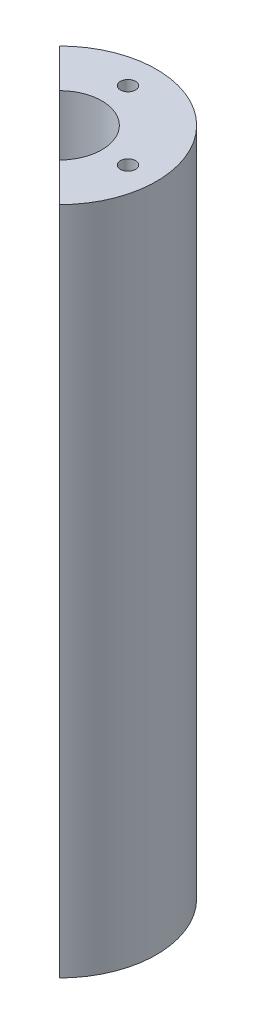
ISO-10303-21;
HEADER;
FILE_DESCRIPTION(('STEP AP214'),'2;1');
FILE_NAME('part.step','',(''),(''),'','','');
FILE_SCHEMA(('AUTOMOTIVE_DESIGN { 1 0 10303 214 1 1 1 1 }'));
ENDSEC;
DATA;
#1=APPLICATION_CONTEXT('core data for automotive mechanical design processes');
#2=APPLICATION_PROTOCOL_DEFINITION('international standard','automotive_design',2000,#1);
#3=PRODUCT_CONTEXT('',#1,'mechanical');
#4=PRODUCT('Part','Part','',(#3));
#5=PRODUCT_RELATED_PRODUCT_CATEGORY('part','',(#4));
#6=PRODUCT_DEFINITION_FORMATION('','',#4);
#7=PRODUCT_DEFINITION_CONTEXT('part definition',#1,'design');
#8=PRODUCT_DEFINITION('design','',#6,#7);
#9=PRODUCT_DEFINITION_SHAPE('','',#8);
#10=(LENGTH_UNIT() NAMED_UNIT(*) SI_UNIT(.MILLI.,.METRE.));
#11=(NAMED_UNIT(*) PLANE_ANGLE_UNIT() SI_UNIT($,.RADIAN.));
#12=(NAMED_UNIT(*) SI_UNIT($,.STERADIAN.) SOLID_ANGLE_UNIT());
#13=UNCERTAINTY_MEASURE_WITH_UNIT(LENGTH_MEASURE(1.E-05),#10,'distance_accuracy_value','');
#14=(GEOMETRIC_REPRESENTATION_CONTEXT(3) GLOBAL_UNCERTAINTY_ASSIGNED_CONTEXT((#13)) GLOBAL_UNIT_ASSIGNED_CONTEXT((#10,
#11,#12)) REPRESENTATION_CONTEXT('',''));
#15=CARTESIAN_POINT('',(0.,0.,0.));
#16=DIRECTION('',(0.,0.,1.));
#17=DIRECTION('',(1.,0.,0.));
#18=AXIS2_PLACEMENT_3D('',#15,#16,#17);
#19=CARTESIAN_POINT('',(0.,110.3,0.));
#20=DIRECTION('',(0.,-1.,0.));
#21=DIRECTION('',(0.,0.,-1.));
#22=AXIS2_PLACEMENT_3D('',#19,#20,#21);
#23=CYLINDRICAL_SURFACE('',#22,16.);
#24=CARTESIAN_POINT('',(0.,0.,0.));
#25=DIRECTION('',(0.,1.,0.));
#26=DIRECTION('',(0.,0.,1.));
#27=AXIS2_PLACEMENT_3D('',#24,#25,#26);
#28=CIRCLE('',#27,16.);
#29=CARTESIAN_POINT('',(11.3137084989848,0.,11.3137084989847));
#30=VERTEX_POINT('',#29);
#31=CARTESIAN_POINT('',(-11.3137084989848,0.,-11.3137084989847));
#32=VERTEX_POINT('',#31);
#33=EDGE_CURVE('E105',#30,#32,#28,.T.);
#34=ORIENTED_EDGE('',*,*,#33,.T.);
#35=DIRECTION('',(0.,-1.,0.));
#36=VECTOR('',#35,1.);
#37=CARTESIAN_POINT('',(-11.3137084989848,110.3,-11.3137084989847));
#38=LINE('',#37,#36);
#39=CARTESIAN_POINT('',(-11.3137084989848,110.3,-11.3137084989847));
#40=VERTEX_POINT('',#39);
#41=EDGE_CURVE('E11',#40,#32,#38,.T.);
#42=ORIENTED_EDGE('',*,*,#41,.F.);
#43=CARTESIAN_POINT('',(0.,110.3,0.));
#44=DIRECTION('',(0.,1.,0.));
#45=DIRECTION('',(0.,0.,1.));
#46=AXIS2_PLACEMENT_3D('',#43,#44,#45);
#47=CIRCLE('',#46,16.);
#48=CARTESIAN_POINT('',(11.3137084989848,110.3,11.3137084989847));
#49=VERTEX_POINT('',#48);
#50=EDGE_CURVE('E75',#49,#40,#47,.T.);
#51=ORIENTED_EDGE('',*,*,#50,.F.);
#52=DIRECTION('',(0.,-1.,0.));
#53=VECTOR('',#52,1.);
#54=CARTESIAN_POINT('',(11.3137084989848,110.3,11.3137084989847));
#55=LINE('',#54,#53);
#56=EDGE_CURVE('E101',#49,#30,#55,.T.);
#57=ORIENTED_EDGE('',*,*,#56,.T.);
#58=EDGE_LOOP('',(#34,#42,#51,#57));
#59=FACE_BOUND('',#58,.T.);
#60=ADVANCED_FACE('F35',(#59),#23,.T.);
#61=CARTESIAN_POINT('',(0.,110.3,0.));
#62=DIRECTION('',(-0.707106781186544,0.,0.707106781186551));
#63=DIRECTION('',(0.707106781186551,0.,0.707106781186544));
#64=AXIS2_PLACEMENT_3D('',#61,#62,#63);
#65=PLANE('',#64);
#66=DIRECTION('',(-0.707106781186551,0.,-0.707106781186544));
#67=VECTOR('',#66,1.);
#68=CARTESIAN_POINT('',(0.,0.,0.));
#69=LINE('',#68,#67);
#70=CARTESIAN_POINT('',(-4.94974746830586,0.,-4.94974746830581));
#71=VERTEX_POINT('',#70);
#72=EDGE_CURVE('E84',#71,#32,#69,.T.);
#73=ORIENTED_EDGE('',*,*,#72,.F.);
#74=DIRECTION('',(0.,-1.,0.));
#75=VECTOR('',#74,1.);
#76=CARTESIAN_POINT('',(-4.94974746830586,110.3,-4.94974746830581));
#77=LINE('',#76,#75);
#78=CARTESIAN_POINT('',(-4.94974746830586,110.3,-4.94974746830581));
#79=VERTEX_POINT('',#78);
#80=EDGE_CURVE('E44',#79,#71,#77,.T.);
#81=ORIENTED_EDGE('',*,*,#80,.F.);
#82=DIRECTION('',(-0.707106781186551,0.,-0.707106781186544));
#83=VECTOR('',#82,1.);
#84=CARTESIAN_POINT('',(0.,110.3,0.));
#85=LINE('',#84,#83);
#86=EDGE_CURVE('E82',#79,#40,#85,.T.);
#87=ORIENTED_EDGE('',*,*,#86,.T.);
#88=ORIENTED_EDGE('',*,*,#41,.T.);
#89=EDGE_LOOP('',(#73,#81,#87,#88));
#90=FACE_BOUND('',#89,.T.);
#91=ADVANCED_FACE('F81',(#90),#65,.T.);
#92=CARTESIAN_POINT('',(0.,110.3,0.));
#93=DIRECTION('',(0.,-1.,0.));
#94=DIRECTION('',(0.,0.,-1.));
#95=AXIS2_PLACEMENT_3D('',#92,#93,#94);
#96=CYLINDRICAL_SURFACE('',#95,7.);
#97=CARTESIAN_POINT('',(0.,0.,0.));
#98=DIRECTION('',(0.,1.,0.));
#99=DIRECTION('',(0.,0.,1.));
#100=AXIS2_PLACEMENT_3D('',#97,#98,#99);
#101=CIRCLE('',#100,7.);
#102=CARTESIAN_POINT('',(4.94974746830586,0.,4.94974746830581));
#103=VERTEX_POINT('',#102);
#104=EDGE_CURVE('E109',#103,#71,#101,.T.);
#105=ORIENTED_EDGE('',*,*,#104,.F.);
#106=DIRECTION('',(0.,-1.,0.));
#107=VECTOR('',#106,1.);
#108=CARTESIAN_POINT('',(4.94974746830586,110.3,4.94974746830581));
#109=LINE('',#108,#107);
#110=CARTESIAN_POINT('',(4.94974746830586,110.3,4.94974746830581));
#111=VERTEX_POINT('',#110);
#112=EDGE_CURVE('E67',#111,#103,#109,.T.);
#113=ORIENTED_EDGE('',*,*,#112,.F.);
#114=CARTESIAN_POINT('',(0.,110.3,0.));
#115=DIRECTION('',(0.,1.,0.));
#116=DIRECTION('',(0.,0.,1.));
#117=AXIS2_PLACEMENT_3D('',#114,#115,#116);
#118=CIRCLE('',#117,7.);
#119=EDGE_CURVE('E91',#111,#79,#118,.T.);
#120=ORIENTED_EDGE('',*,*,#119,.T.);
#121=ORIENTED_EDGE('',*,*,#80,.T.);
#122=EDGE_LOOP('',(#105,#113,#120,#121));
#123=FACE_BOUND('',#122,.T.);
#124=ADVANCED_FACE('F93',(#123),#96,.F.);
#125=CARTESIAN_POINT('',(0.,110.3,0.));
#126=DIRECTION('',(0.707106781186544,0.,-0.707106781186551));
#127=DIRECTION('',(-0.707106781186551,0.,-0.707106781186544));
#128=AXIS2_PLACEMENT_3D('',#125,#126,#127);
#129=PLANE('',#128);
#130=DIRECTION('',(0.707106781186551,0.,0.707106781186544));
#131=VECTOR('',#130,1.);
#132=CARTESIAN_POINT('',(0.,0.,0.));
#133=LINE('',#132,#131);
#134=EDGE_CURVE('E70',#103,#30,#133,.T.);
#135=ORIENTED_EDGE('',*,*,#134,.T.);
#136=ORIENTED_EDGE('',*,*,#56,.F.);
#137=DIRECTION('',(0.707106781186551,0.,0.707106781186544));
#138=VECTOR('',#137,1.);
#139=CARTESIAN_POINT('',(0.,110.3,0.));
#140=LINE('',#139,#138);
#141=EDGE_CURVE('E52',#111,#49,#140,.T.);
#142=ORIENTED_EDGE('',*,*,#141,.F.);
#143=ORIENTED_EDGE('',*,*,#112,.T.);
#144=EDGE_LOOP('',(#135,#136,#142,#143));
#145=FACE_BOUND('',#144,.T.);
#146=ADVANCED_FACE('F137',(#145),#129,.F.);
#147=CARTESIAN_POINT('',(0.,110.3,-11.3137084989848));
#148=DIRECTION('',(0.,-1.,0.));
#149=DIRECTION('',(0.,0.,-1.));
#150=AXIS2_PLACEMENT_3D('',#147,#148,#149);
#151=CYLINDRICAL_SURFACE('',#150,1.25);
#152=CARTESIAN_POINT('',(0.,110.3,-11.3137084989848));
#153=DIRECTION('',(0.,1.,0.));
#154=DIRECTION('',(0.,0.,1.));
#155=AXIS2_PLACEMENT_3D('',#152,#153,#154);
#156=CIRCLE('',#155,1.25);
#157=CARTESIAN_POINT('',(0.,110.3,-10.0637084989848));
#158=VERTEX_POINT('',#157);
#159=EDGE_CURVE('E115',#158,#158,#156,.T.);
#160=ORIENTED_EDGE('',*,*,#159,.T.);
#161=EDGE_LOOP('',(#160));
#162=FACE_BOUND('',#161,.T.);
#163=CARTESIAN_POINT('',(0.,0.,-11.3137084989848));
#164=DIRECTION('',(0.,1.,0.));
#165=DIRECTION('',(0.,0.,1.));
#166=AXIS2_PLACEMENT_3D('',#163,#164,#165);
#167=CIRCLE('',#166,1.25);
#168=CARTESIAN_POINT('',(0.,0.,-10.0637084989848));
#169=VERTEX_POINT('',#168);
#170=EDGE_CURVE('E102',#169,#169,#167,.T.);
#171=ORIENTED_EDGE('',*,*,#170,.F.);
#172=EDGE_LOOP('',(#171));
#173=FACE_BOUND('',#172,.T.);
#174=ADVANCED_FACE('F37',(#162,#173),#151,.F.);
#175=CARTESIAN_POINT('',(11.3137084989848,110.3,0.));
#176=DIRECTION('',(0.,-1.,0.));
#177=DIRECTION('',(0.,0.,-1.));
#178=AXIS2_PLACEMENT_3D('',#175,#176,#177);
#179=CYLINDRICAL_SURFACE('',#178,1.25);
#180=CARTESIAN_POINT('',(11.3137084989848,110.3,0.));
#181=DIRECTION('',(0.,1.,0.));
#182=DIRECTION('',(0.,0.,1.));
#183=AXIS2_PLACEMENT_3D('',#180,#181,#182);
#184=CIRCLE('',#183,1.25);
#185=CARTESIAN_POINT('',(11.3137084989848,110.3,1.25));
#186=VERTEX_POINT('',#185);
#187=EDGE_CURVE('E95',#186,#186,#184,.T.);
#188=ORIENTED_EDGE('',*,*,#187,.T.);
#189=EDGE_LOOP('',(#188));
#190=FACE_BOUND('',#189,.T.);
#191=CARTESIAN_POINT('',(11.3137084989848,0.,0.));
#192=DIRECTION('',(0.,1.,0.));
#193=DIRECTION('',(0.,0.,1.));
#194=AXIS2_PLACEMENT_3D('',#191,#192,#193);
#195=CIRCLE('',#194,1.25);
#196=CARTESIAN_POINT('',(11.3137084989848,0.,1.25));
#197=VERTEX_POINT('',#196);
#198=EDGE_CURVE('E112',#197,#197,#195,.T.);
#199=ORIENTED_EDGE('',*,*,#198,.F.);
#200=EDGE_LOOP('',(#199));
#201=FACE_BOUND('',#200,.T.);
#202=ADVANCED_FACE('F127',(#190,#201),#179,.F.);
#203=CARTESIAN_POINT('',(0.,110.3,0.));
#204=DIRECTION('',(0.,1.,0.));
#205=DIRECTION('',(0.,0.,1.));
#206=AXIS2_PLACEMENT_3D('',#203,#204,#205);
#207=PLANE('',#206);
#208=ORIENTED_EDGE('',*,*,#159,.F.);
#209=EDGE_LOOP('',(#208));
#210=FACE_BOUND('',#209,.T.);
#211=ORIENTED_EDGE('',*,*,#50,.T.);
#212=ORIENTED_EDGE('',*,*,#86,.F.);
#213=ORIENTED_EDGE('',*,*,#119,.F.);
#214=ORIENTED_EDGE('',*,*,#141,.T.);
#215=EDGE_LOOP('',(#211,#212,#213,#214));
#216=FACE_BOUND('',#215,.T.);
#217=ORIENTED_EDGE('',*,*,#187,.F.);
#218=EDGE_LOOP('',(#217));
#219=FACE_BOUND('',#218,.T.);
#220=ADVANCED_FACE('F89',(#210,#216,#219),#207,.T.);
#221=CARTESIAN_POINT('',(0.,0.,0.));
#222=DIRECTION('',(0.,1.,0.));
#223=DIRECTION('',(0.,0.,1.));
#224=AXIS2_PLACEMENT_3D('',#221,#222,#223);
#225=PLANE('',#224);
#226=ORIENTED_EDGE('',*,*,#170,.T.);
#227=EDGE_LOOP('',(#226));
#228=FACE_BOUND('',#227,.T.);
#229=ORIENTED_EDGE('',*,*,#33,.F.);
#230=ORIENTED_EDGE('',*,*,#134,.F.);
#231=ORIENTED_EDGE('',*,*,#104,.T.);
#232=ORIENTED_EDGE('',*,*,#72,.T.);
#233=EDGE_LOOP('',(#229,#230,#231,#232));
#234=FACE_BOUND('',#233,.T.);
#235=ORIENTED_EDGE('',*,*,#198,.T.);
#236=EDGE_LOOP('',(#235));
#237=FACE_BOUND('',#236,.T.);
#238=ADVANCED_FACE('F120',(#228,#234,#237),#225,.F.);
#239=CLOSED_SHELL('',(#60,#91,#124,#146,#174,#202,#220,#238));
#240=MANIFOLD_SOLID_BREP('B2',#239);
#241=ADVANCED_BREP_SHAPE_REPRESENTATION('',(#18,#240),#14);
#242=SHAPE_DEFINITION_REPRESENTATION(#9,#241);
ENDSEC;
END-ISO-10303-21;
